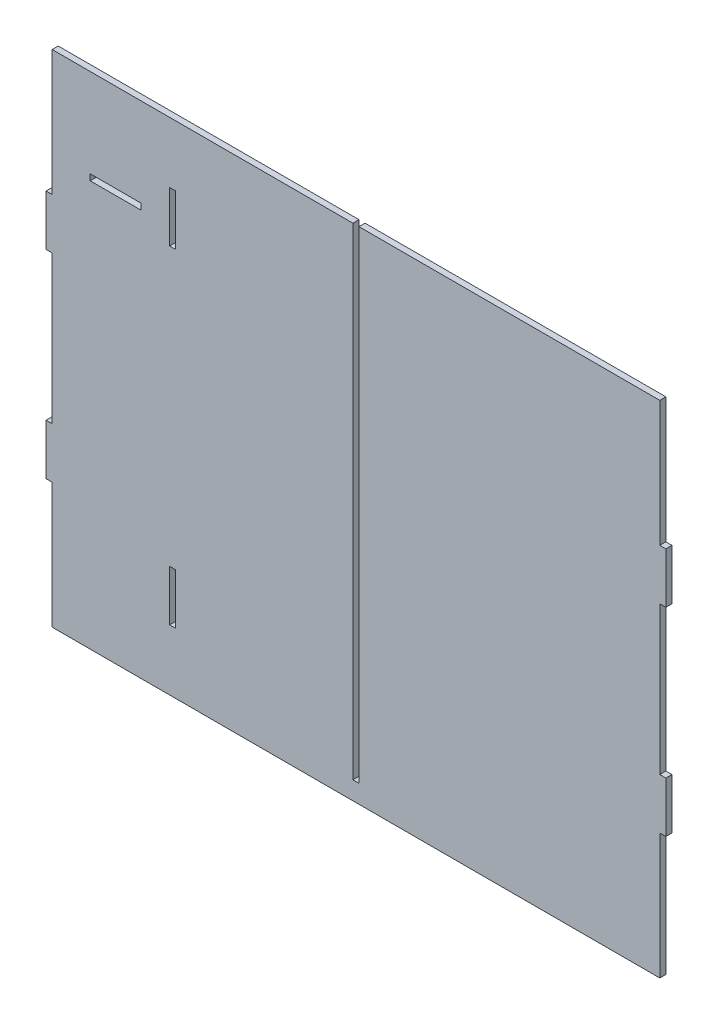
ISO-10303-21;
HEADER;
FILE_DESCRIPTION(('STEP AP214'),'2;1');
FILE_NAME('part.step','',(''),(''),'','','');
FILE_SCHEMA(('AUTOMOTIVE_DESIGN { 1 0 10303 214 1 1 1 1 }'));
ENDSEC;
DATA;
#1=APPLICATION_CONTEXT('core data for automotive mechanical design processes');
#2=APPLICATION_PROTOCOL_DEFINITION('international standard','automotive_design',2000,#1);
#3=PRODUCT_CONTEXT('',#1,'mechanical');
#4=PRODUCT('Part','Part','',(#3));
#5=PRODUCT_RELATED_PRODUCT_CATEGORY('part','',(#4));
#6=PRODUCT_DEFINITION_FORMATION('','',#4);
#7=PRODUCT_DEFINITION_CONTEXT('part definition',#1,'design');
#8=PRODUCT_DEFINITION('design','',#6,#7);
#9=PRODUCT_DEFINITION_SHAPE('','',#8);
#10=(LENGTH_UNIT() NAMED_UNIT(*) SI_UNIT(.MILLI.,.METRE.));
#11=(NAMED_UNIT(*) PLANE_ANGLE_UNIT() SI_UNIT($,.RADIAN.));
#12=(NAMED_UNIT(*) SI_UNIT($,.STERADIAN.) SOLID_ANGLE_UNIT());
#13=UNCERTAINTY_MEASURE_WITH_UNIT(LENGTH_MEASURE(1.E-05),#10,'distance_accuracy_value','');
#14=(GEOMETRIC_REPRESENTATION_CONTEXT(3) GLOBAL_UNCERTAINTY_ASSIGNED_CONTEXT((#13)) GLOBAL_UNIT_ASSIGNED_CONTEXT((#10,
#11,#12)) REPRESENTATION_CONTEXT('',''));
#15=CARTESIAN_POINT('',(0.,0.,0.));
#16=DIRECTION('',(0.,0.,1.));
#17=DIRECTION('',(1.,0.,0.));
#18=AXIS2_PLACEMENT_3D('',#15,#16,#17);
#19=CARTESIAN_POINT('',(0.,0.,6.));
#20=DIRECTION('',(0.,0.,-1.));
#21=DIRECTION('',(-1.,0.,0.));
#22=AXIS2_PLACEMENT_3D('',#19,#20,#21);
#23=PLANE('',#22);
#24=DIRECTION('',(0.,-1.,0.));
#25=VECTOR('',#24,1.);
#26=CARTESIAN_POINT('',(116.,-434.,6.));
#27=LINE('',#26,#25);
#28=CARTESIAN_POINT('',(116.,-384.,6.));
#29=VERTEX_POINT('',#28);
#30=CARTESIAN_POINT('',(116.,-434.,6.));
#31=VERTEX_POINT('',#30);
#32=EDGE_CURVE('E302',#29,#31,#27,.T.);
#33=ORIENTED_EDGE('',*,*,#32,.F.);
#34=DIRECTION('',(-1.,0.,0.));
#35=VECTOR('',#34,1.);
#36=CARTESIAN_POINT('',(116.,-384.,6.));
#37=LINE('',#36,#35);
#38=CARTESIAN_POINT('',(122.,-384.,6.));
#39=VERTEX_POINT('',#38);
#40=EDGE_CURVE('E310',#39,#29,#37,.T.);
#41=ORIENTED_EDGE('',*,*,#40,.F.);
#42=DIRECTION('',(0.,1.,0.));
#43=VECTOR('',#42,1.);
#44=CARTESIAN_POINT('',(122.,-434.,6.));
#45=LINE('',#44,#43);
#46=CARTESIAN_POINT('',(122.,-434.,6.));
#47=VERTEX_POINT('',#46);
#48=EDGE_CURVE('E307',#47,#39,#45,.T.);
#49=ORIENTED_EDGE('',*,*,#48,.F.);
#50=DIRECTION('',(1.,0.,0.));
#51=VECTOR('',#50,1.);
#52=CARTESIAN_POINT('',(116.,-434.,6.));
#53=LINE('',#52,#51);
#54=EDGE_CURVE('E304',#31,#47,#53,.T.);
#55=ORIENTED_EDGE('',*,*,#54,.F.);
#56=EDGE_LOOP('',(#33,#41,#49,#55));
#57=FACE_BOUND('',#56,.T.);
#58=DIRECTION('',(0.,-1.,0.));
#59=VECTOR('',#58,1.);
#60=CARTESIAN_POINT('',(0.,0.,6.));
#61=LINE('',#60,#59);
#62=CARTESIAN_POINT('',(0.,0.,6.));
#63=VERTEX_POINT('',#62);
#64=CARTESIAN_POINT('',(0.,-124.,6.));
#65=VERTEX_POINT('',#64);
#66=EDGE_CURVE('E364',#63,#65,#61,.T.);
#67=ORIENTED_EDGE('',*,*,#66,.T.);
#68=DIRECTION('',(-1.,0.,0.));
#69=VECTOR('',#68,1.);
#70=CARTESIAN_POINT('',(0.,-124.,6.));
#71=LINE('',#70,#69);
#72=CARTESIAN_POINT('',(-5.99999999999989,-124.,6.));
#73=VERTEX_POINT('',#72);
#74=EDGE_CURVE('E367',#65,#73,#71,.T.);
#75=ORIENTED_EDGE('',*,*,#74,.T.);
#76=DIRECTION('',(0.,-1.,0.));
#77=VECTOR('',#76,1.);
#78=CARTESIAN_POINT('',(-5.99999999999989,-124.,6.));
#79=LINE('',#78,#77);
#80=CARTESIAN_POINT('',(-5.99999999999989,-174.,6.));
#81=VERTEX_POINT('',#80);
#82=EDGE_CURVE('E370',#73,#81,#79,.T.);
#83=ORIENTED_EDGE('',*,*,#82,.T.);
#84=DIRECTION('',(1.,0.,0.));
#85=VECTOR('',#84,1.);
#86=CARTESIAN_POINT('',(0.,-174.,6.));
#87=LINE('',#86,#85);
#88=CARTESIAN_POINT('',(0.,-174.,6.));
#89=VERTEX_POINT('',#88);
#90=EDGE_CURVE('E372',#81,#89,#87,.T.);
#91=ORIENTED_EDGE('',*,*,#90,.T.);
#92=DIRECTION('',(0.,-1.,0.));
#93=VECTOR('',#92,1.);
#94=CARTESIAN_POINT('',(0.,-174.,6.));
#95=LINE('',#94,#93);
#96=CARTESIAN_POINT('',(0.,-320.,6.));
#97=VERTEX_POINT('',#96);
#98=EDGE_CURVE('E374',#89,#97,#95,.T.);
#99=ORIENTED_EDGE('',*,*,#98,.T.);
#100=DIRECTION('',(-1.,0.,0.));
#101=VECTOR('',#100,1.);
#102=CARTESIAN_POINT('',(0.,-320.,6.));
#103=LINE('',#102,#101);
#104=CARTESIAN_POINT('',(-5.99999999999988,-320.,6.));
#105=VERTEX_POINT('',#104);
#106=EDGE_CURVE('E376',#97,#105,#103,.T.);
#107=ORIENTED_EDGE('',*,*,#106,.T.);
#108=DIRECTION('',(0.,-1.,0.));
#109=VECTOR('',#108,1.);
#110=CARTESIAN_POINT('',(-5.99999999999986,-370.,6.));
#111=LINE('',#110,#109);
#112=CARTESIAN_POINT('',(-5.99999999999986,-370.,6.));
#113=VERTEX_POINT('',#112);
#114=EDGE_CURVE('E378',#105,#113,#111,.T.);
#115=ORIENTED_EDGE('',*,*,#114,.T.);
#116=DIRECTION('',(1.,0.,0.));
#117=VECTOR('',#116,1.);
#118=CARTESIAN_POINT('',(0.,-370.,6.));
#119=LINE('',#118,#117);
#120=CARTESIAN_POINT('',(0.,-370.,6.));
#121=VERTEX_POINT('',#120);
#122=EDGE_CURVE('E380',#113,#121,#119,.T.);
#123=ORIENTED_EDGE('',*,*,#122,.T.);
#124=DIRECTION('',(0.,-1.,0.));
#125=VECTOR('',#124,1.);
#126=CARTESIAN_POINT('',(0.,-370.,6.));
#127=LINE('',#126,#125);
#128=CARTESIAN_POINT('',(0.,-494.,6.));
#129=VERTEX_POINT('',#128);
#130=EDGE_CURVE('E382',#121,#129,#127,.T.);
#131=ORIENTED_EDGE('',*,*,#130,.T.);
#132=DIRECTION('',(1.,0.,0.));
#133=VECTOR('',#132,1.);
#134=CARTESIAN_POINT('',(0.,-494.,6.));
#135=LINE('',#134,#133);
#136=CARTESIAN_POINT('',(600.,-494.,6.));
#137=VERTEX_POINT('',#136);
#138=EDGE_CURVE('E384',#129,#137,#135,.T.);
#139=ORIENTED_EDGE('',*,*,#138,.T.);
#140=DIRECTION('',(0.,1.,0.));
#141=VECTOR('',#140,1.);
#142=CARTESIAN_POINT('',(600.,-370.,6.));
#143=LINE('',#142,#141);
#144=CARTESIAN_POINT('',(600.,-370.,6.));
#145=VERTEX_POINT('',#144);
#146=EDGE_CURVE('E386',#137,#145,#143,.T.);
#147=ORIENTED_EDGE('',*,*,#146,.T.);
#148=DIRECTION('',(1.,0.,0.));
#149=VECTOR('',#148,1.);
#150=CARTESIAN_POINT('',(600.,-370.,6.));
#151=LINE('',#150,#149);
#152=CARTESIAN_POINT('',(606.,-370.,6.));
#153=VERTEX_POINT('',#152);
#154=EDGE_CURVE('E388',#145,#153,#151,.T.);
#155=ORIENTED_EDGE('',*,*,#154,.T.);
#156=DIRECTION('',(0.,1.,0.));
#157=VECTOR('',#156,1.);
#158=CARTESIAN_POINT('',(606.,-370.,6.));
#159=LINE('',#158,#157);
#160=CARTESIAN_POINT('',(606.,-320.,6.));
#161=VERTEX_POINT('',#160);
#162=EDGE_CURVE('E390',#153,#161,#159,.T.);
#163=ORIENTED_EDGE('',*,*,#162,.T.);
#164=DIRECTION('',(-1.,0.,0.));
#165=VECTOR('',#164,1.);
#166=CARTESIAN_POINT('',(600.,-320.,6.));
#167=LINE('',#166,#165);
#168=CARTESIAN_POINT('',(600.,-320.,6.));
#169=VERTEX_POINT('',#168);
#170=EDGE_CURVE('E392',#161,#169,#167,.T.);
#171=ORIENTED_EDGE('',*,*,#170,.T.);
#172=DIRECTION('',(0.,1.,0.));
#173=VECTOR('',#172,1.);
#174=CARTESIAN_POINT('',(600.,-174.,6.));
#175=LINE('',#174,#173);
#176=CARTESIAN_POINT('',(600.,-174.,6.));
#177=VERTEX_POINT('',#176);
#178=EDGE_CURVE('E394',#169,#177,#175,.T.);
#179=ORIENTED_EDGE('',*,*,#178,.T.);
#180=DIRECTION('',(1.,0.,0.));
#181=VECTOR('',#180,1.);
#182=CARTESIAN_POINT('',(600.,-174.,6.));
#183=LINE('',#182,#181);
#184=CARTESIAN_POINT('',(606.,-174.,6.));
#185=VERTEX_POINT('',#184);
#186=EDGE_CURVE('E396',#177,#185,#183,.T.);
#187=ORIENTED_EDGE('',*,*,#186,.T.);
#188=DIRECTION('',(0.,1.,0.));
#189=VECTOR('',#188,1.);
#190=CARTESIAN_POINT('',(606.,-124.,6.));
#191=LINE('',#190,#189);
#192=CARTESIAN_POINT('',(606.,-124.,6.));
#193=VERTEX_POINT('',#192);
#194=EDGE_CURVE('E398',#185,#193,#191,.T.);
#195=ORIENTED_EDGE('',*,*,#194,.T.);
#196=DIRECTION('',(-1.,0.,0.));
#197=VECTOR('',#196,1.);
#198=CARTESIAN_POINT('',(600.,-124.,6.));
#199=LINE('',#198,#197);
#200=CARTESIAN_POINT('',(600.,-124.,6.));
#201=VERTEX_POINT('',#200);
#202=EDGE_CURVE('E400',#193,#201,#199,.T.);
#203=ORIENTED_EDGE('',*,*,#202,.T.);
#204=DIRECTION('',(0.,1.,0.));
#205=VECTOR('',#204,1.);
#206=CARTESIAN_POINT('',(600.,0.,6.));
#207=LINE('',#206,#205);
#208=CARTESIAN_POINT('',(600.,0.,6.));
#209=VERTEX_POINT('',#208);
#210=EDGE_CURVE('E402',#201,#209,#207,.T.);
#211=ORIENTED_EDGE('',*,*,#210,.T.);
#212=DIRECTION('',(-1.,0.,0.));
#213=VECTOR('',#212,1.);
#214=CARTESIAN_POINT('',(303.,0.,6.));
#215=LINE('',#214,#213);
#216=CARTESIAN_POINT('',(303.,0.,6.));
#217=VERTEX_POINT('',#216);
#218=EDGE_CURVE('E404',#209,#217,#215,.T.);
#219=ORIENTED_EDGE('',*,*,#218,.T.);
#220=DIRECTION('',(0.,-1.,0.));
#221=VECTOR('',#220,1.);
#222=CARTESIAN_POINT('',(303.,0.,6.));
#223=LINE('',#222,#221);
#224=CARTESIAN_POINT('',(303.,-476.,6.));
#225=VERTEX_POINT('',#224);
#226=EDGE_CURVE('E406',#217,#225,#223,.T.);
#227=ORIENTED_EDGE('',*,*,#226,.T.);
#228=DIRECTION('',(-1.,0.,0.));
#229=VECTOR('',#228,1.);
#230=CARTESIAN_POINT('',(297.,-476.,6.));
#231=LINE('',#230,#229);
#232=CARTESIAN_POINT('',(297.,-476.,6.));
#233=VERTEX_POINT('',#232);
#234=EDGE_CURVE('E408',#225,#233,#231,.T.);
#235=ORIENTED_EDGE('',*,*,#234,.T.);
#236=DIRECTION('',(0.,1.,0.));
#237=VECTOR('',#236,1.);
#238=CARTESIAN_POINT('',(297.,0.,6.));
#239=LINE('',#238,#237);
#240=CARTESIAN_POINT('',(297.,0.,6.));
#241=VERTEX_POINT('',#240);
#242=EDGE_CURVE('E410',#233,#241,#239,.T.);
#243=ORIENTED_EDGE('',*,*,#242,.T.);
#244=DIRECTION('',(-1.,0.,0.));
#245=VECTOR('',#244,1.);
#246=CARTESIAN_POINT('',(0.,0.,6.));
#247=LINE('',#246,#245);
#248=EDGE_CURVE('E412',#241,#63,#247,.T.);
#249=ORIENTED_EDGE('',*,*,#248,.T.);
#250=EDGE_LOOP('',(#67,#75,#83,#91,#99,#107,#115,#123,#131,#139,#147,#155,#163,#171,#179,#187,
#195,#203,#211,#219,#227,#235,#243,#249));
#251=FACE_BOUND('',#250,.T.);
#252=DIRECTION('',(0.,1.,0.));
#253=VECTOR('',#252,1.);
#254=CARTESIAN_POINT('',(122.,-60.,6.));
#255=LINE('',#254,#253);
#256=CARTESIAN_POINT('',(122.,-110.,6.));
#257=VERTEX_POINT('',#256);
#258=CARTESIAN_POINT('',(122.,-60.,6.));
#259=VERTEX_POINT('',#258);
#260=EDGE_CURVE('E333',#257,#259,#255,.T.);
#261=ORIENTED_EDGE('',*,*,#260,.F.);
#262=DIRECTION('',(1.,0.,0.));
#263=VECTOR('',#262,1.);
#264=CARTESIAN_POINT('',(116.,-110.,6.));
#265=LINE('',#264,#263);
#266=CARTESIAN_POINT('',(116.,-110.,6.));
#267=VERTEX_POINT('',#266);
#268=EDGE_CURVE('E341',#267,#257,#265,.T.);
#269=ORIENTED_EDGE('',*,*,#268,.F.);
#270=DIRECTION('',(0.,-1.,0.));
#271=VECTOR('',#270,1.);
#272=CARTESIAN_POINT('',(116.,-60.,6.));
#273=LINE('',#272,#271);
#274=CARTESIAN_POINT('',(116.,-60.,6.));
#275=VERTEX_POINT('',#274);
#276=EDGE_CURVE('E338',#275,#267,#273,.T.);
#277=ORIENTED_EDGE('',*,*,#276,.F.);
#278=DIRECTION('',(-1.,0.,0.));
#279=VECTOR('',#278,1.);
#280=CARTESIAN_POINT('',(116.,-60.,6.));
#281=LINE('',#280,#279);
#282=EDGE_CURVE('E335',#259,#275,#281,.T.);
#283=ORIENTED_EDGE('',*,*,#282,.F.);
#284=EDGE_LOOP('',(#261,#269,#277,#283));
#285=FACE_BOUND('',#284,.T.);
#286=DIRECTION('',(0.,1.,0.));
#287=VECTOR('',#286,1.);
#288=CARTESIAN_POINT('',(87.5,-87.5,6.));
#289=LINE('',#288,#287);
#290=CARTESIAN_POINT('',(87.5,-93.5,6.));
#291=VERTEX_POINT('',#290);
#292=CARTESIAN_POINT('',(87.5,-87.5,6.));
#293=VERTEX_POINT('',#292);
#294=EDGE_CURVE('E266',#291,#293,#289,.T.);
#295=ORIENTED_EDGE('',*,*,#294,.F.);
#296=DIRECTION('',(1.,0.,0.));
#297=VECTOR('',#296,1.);
#298=CARTESIAN_POINT('',(37.5,-93.5,6.));
#299=LINE('',#298,#297);
#300=CARTESIAN_POINT('',(37.5,-93.5,6.));
#301=VERTEX_POINT('',#300);
#302=EDGE_CURVE('E288',#301,#291,#299,.T.);
#303=ORIENTED_EDGE('',*,*,#302,.F.);
#304=DIRECTION('',(0.,-1.,0.));
#305=VECTOR('',#304,1.);
#306=CARTESIAN_POINT('',(37.5,-87.5,6.));
#307=LINE('',#306,#305);
#308=CARTESIAN_POINT('',(37.5,-87.5,6.));
#309=VERTEX_POINT('',#308);
#310=EDGE_CURVE('E286',#309,#301,#307,.T.);
#311=ORIENTED_EDGE('',*,*,#310,.F.);
#312=DIRECTION('',(-1.,0.,0.));
#313=VECTOR('',#312,1.);
#314=CARTESIAN_POINT('',(37.5,-87.5,6.));
#315=LINE('',#314,#313);
#316=EDGE_CURVE('E274',#293,#309,#315,.T.);
#317=ORIENTED_EDGE('',*,*,#316,.F.);
#318=EDGE_LOOP('',(#295,#303,#311,#317));
#319=FACE_BOUND('',#318,.T.);
#320=ADVANCED_FACE('F33',(#57,#251,#285,#319),#23,.F.);
#321=CARTESIAN_POINT('',(0.,0.,0.));
#322=DIRECTION('',(0.,0.,-1.));
#323=DIRECTION('',(-1.,0.,0.));
#324=AXIS2_PLACEMENT_3D('',#321,#322,#323);
#325=PLANE('',#324);
#326=DIRECTION('',(0.,-1.,0.));
#327=VECTOR('',#326,1.);
#328=CARTESIAN_POINT('',(0.,0.,0.));
#329=LINE('',#328,#327);
#330=CARTESIAN_POINT('',(0.,0.,0.));
#331=VERTEX_POINT('',#330);
#332=CARTESIAN_POINT('',(0.,-124.,0.));
#333=VERTEX_POINT('',#332);
#334=EDGE_CURVE('E363',#331,#333,#329,.T.);
#335=ORIENTED_EDGE('',*,*,#334,.F.);
#336=DIRECTION('',(-1.,0.,0.));
#337=VECTOR('',#336,1.);
#338=CARTESIAN_POINT('',(0.,0.,0.));
#339=LINE('',#338,#337);
#340=CARTESIAN_POINT('',(297.,0.,0.));
#341=VERTEX_POINT('',#340);
#342=EDGE_CURVE('E368',#341,#331,#339,.T.);
#343=ORIENTED_EDGE('',*,*,#342,.F.);
#344=DIRECTION('',(0.,1.,0.));
#345=VECTOR('',#344,1.);
#346=CARTESIAN_POINT('',(297.,0.,0.));
#347=LINE('',#346,#345);
#348=CARTESIAN_POINT('',(297.,-476.,0.));
#349=VERTEX_POINT('',#348);
#350=EDGE_CURVE('E459',#349,#341,#347,.T.);
#351=ORIENTED_EDGE('',*,*,#350,.F.);
#352=DIRECTION('',(-1.,0.,0.));
#353=VECTOR('',#352,1.);
#354=CARTESIAN_POINT('',(297.,-476.,0.));
#355=LINE('',#354,#353);
#356=CARTESIAN_POINT('',(303.,-476.,0.));
#357=VERTEX_POINT('',#356);
#358=EDGE_CURVE('E457',#357,#349,#355,.T.);
#359=ORIENTED_EDGE('',*,*,#358,.F.);
#360=DIRECTION('',(0.,-1.,0.));
#361=VECTOR('',#360,1.);
#362=CARTESIAN_POINT('',(303.,0.,0.));
#363=LINE('',#362,#361);
#364=CARTESIAN_POINT('',(303.,0.,0.));
#365=VERTEX_POINT('',#364);
#366=EDGE_CURVE('E455',#365,#357,#363,.T.);
#367=ORIENTED_EDGE('',*,*,#366,.F.);
#368=DIRECTION('',(-1.,0.,0.));
#369=VECTOR('',#368,1.);
#370=CARTESIAN_POINT('',(303.,0.,0.));
#371=LINE('',#370,#369);
#372=CARTESIAN_POINT('',(600.,0.,0.));
#373=VERTEX_POINT('',#372);
#374=EDGE_CURVE('E453',#373,#365,#371,.T.);
#375=ORIENTED_EDGE('',*,*,#374,.F.);
#376=DIRECTION('',(0.,1.,0.));
#377=VECTOR('',#376,1.);
#378=CARTESIAN_POINT('',(600.,0.,0.));
#379=LINE('',#378,#377);
#380=CARTESIAN_POINT('',(600.,-124.,0.));
#381=VERTEX_POINT('',#380);
#382=EDGE_CURVE('E451',#381,#373,#379,.T.);
#383=ORIENTED_EDGE('',*,*,#382,.F.);
#384=DIRECTION('',(-1.,0.,0.));
#385=VECTOR('',#384,1.);
#386=CARTESIAN_POINT('',(600.,-124.,0.));
#387=LINE('',#386,#385);
#388=CARTESIAN_POINT('',(606.,-124.,0.));
#389=VERTEX_POINT('',#388);
#390=EDGE_CURVE('E449',#389,#381,#387,.T.);
#391=ORIENTED_EDGE('',*,*,#390,.F.);
#392=DIRECTION('',(0.,1.,0.));
#393=VECTOR('',#392,1.);
#394=CARTESIAN_POINT('',(606.,-124.,0.));
#395=LINE('',#394,#393);
#396=CARTESIAN_POINT('',(606.,-174.,0.));
#397=VERTEX_POINT('',#396);
#398=EDGE_CURVE('E447',#397,#389,#395,.T.);
#399=ORIENTED_EDGE('',*,*,#398,.F.);
#400=DIRECTION('',(1.,0.,0.));
#401=VECTOR('',#400,1.);
#402=CARTESIAN_POINT('',(600.,-174.,0.));
#403=LINE('',#402,#401);
#404=CARTESIAN_POINT('',(600.,-174.,0.));
#405=VERTEX_POINT('',#404);
#406=EDGE_CURVE('E445',#405,#397,#403,.T.);
#407=ORIENTED_EDGE('',*,*,#406,.F.);
#408=DIRECTION('',(0.,1.,0.));
#409=VECTOR('',#408,1.);
#410=CARTESIAN_POINT('',(600.,-174.,0.));
#411=LINE('',#410,#409);
#412=CARTESIAN_POINT('',(600.,-320.,0.));
#413=VERTEX_POINT('',#412);
#414=EDGE_CURVE('E443',#413,#405,#411,.T.);
#415=ORIENTED_EDGE('',*,*,#414,.F.);
#416=DIRECTION('',(-1.,0.,0.));
#417=VECTOR('',#416,1.);
#418=CARTESIAN_POINT('',(600.,-320.,0.));
#419=LINE('',#418,#417);
#420=CARTESIAN_POINT('',(606.,-320.,0.));
#421=VERTEX_POINT('',#420);
#422=EDGE_CURVE('E441',#421,#413,#419,.T.);
#423=ORIENTED_EDGE('',*,*,#422,.F.);
#424=DIRECTION('',(0.,1.,0.));
#425=VECTOR('',#424,1.);
#426=CARTESIAN_POINT('',(606.,-370.,0.));
#427=LINE('',#426,#425);
#428=CARTESIAN_POINT('',(606.,-370.,0.));
#429=VERTEX_POINT('',#428);
#430=EDGE_CURVE('E439',#429,#421,#427,.T.);
#431=ORIENTED_EDGE('',*,*,#430,.F.);
#432=DIRECTION('',(1.,0.,0.));
#433=VECTOR('',#432,1.);
#434=CARTESIAN_POINT('',(600.,-370.,0.));
#435=LINE('',#434,#433);
#436=CARTESIAN_POINT('',(600.,-370.,0.));
#437=VERTEX_POINT('',#436);
#438=EDGE_CURVE('E437',#437,#429,#435,.T.);
#439=ORIENTED_EDGE('',*,*,#438,.F.);
#440=DIRECTION('',(0.,1.,0.));
#441=VECTOR('',#440,1.);
#442=CARTESIAN_POINT('',(600.,-370.,0.));
#443=LINE('',#442,#441);
#444=CARTESIAN_POINT('',(600.,-494.,0.));
#445=VERTEX_POINT('',#444);
#446=EDGE_CURVE('E435',#445,#437,#443,.T.);
#447=ORIENTED_EDGE('',*,*,#446,.F.);
#448=DIRECTION('',(1.,0.,0.));
#449=VECTOR('',#448,1.);
#450=CARTESIAN_POINT('',(0.,-494.,0.));
#451=LINE('',#450,#449);
#452=CARTESIAN_POINT('',(0.,-494.,0.));
#453=VERTEX_POINT('',#452);
#454=EDGE_CURVE('E433',#453,#445,#451,.T.);
#455=ORIENTED_EDGE('',*,*,#454,.F.);
#456=DIRECTION('',(0.,-1.,0.));
#457=VECTOR('',#456,1.);
#458=CARTESIAN_POINT('',(0.,-370.,0.));
#459=LINE('',#458,#457);
#460=CARTESIAN_POINT('',(0.,-370.,0.));
#461=VERTEX_POINT('',#460);
#462=EDGE_CURVE('E431',#461,#453,#459,.T.);
#463=ORIENTED_EDGE('',*,*,#462,.F.);
#464=DIRECTION('',(1.,0.,0.));
#465=VECTOR('',#464,1.);
#466=CARTESIAN_POINT('',(0.,-370.,0.));
#467=LINE('',#466,#465);
#468=CARTESIAN_POINT('',(-5.99999999999986,-370.,0.));
#469=VERTEX_POINT('',#468);
#470=EDGE_CURVE('E429',#469,#461,#467,.T.);
#471=ORIENTED_EDGE('',*,*,#470,.F.);
#472=DIRECTION('',(0.,-1.,0.));
#473=VECTOR('',#472,1.);
#474=CARTESIAN_POINT('',(-5.99999999999986,-370.,0.));
#475=LINE('',#474,#473);
#476=CARTESIAN_POINT('',(-5.99999999999988,-320.,0.));
#477=VERTEX_POINT('',#476);
#478=EDGE_CURVE('E427',#477,#469,#475,.T.);
#479=ORIENTED_EDGE('',*,*,#478,.F.);
#480=DIRECTION('',(-1.,0.,0.));
#481=VECTOR('',#480,1.);
#482=CARTESIAN_POINT('',(0.,-320.,0.));
#483=LINE('',#482,#481);
#484=CARTESIAN_POINT('',(0.,-320.,0.));
#485=VERTEX_POINT('',#484);
#486=EDGE_CURVE('E425',#485,#477,#483,.T.);
#487=ORIENTED_EDGE('',*,*,#486,.F.);
#488=DIRECTION('',(0.,-1.,0.));
#489=VECTOR('',#488,1.);
#490=CARTESIAN_POINT('',(0.,-174.,0.));
#491=LINE('',#490,#489);
#492=CARTESIAN_POINT('',(0.,-174.,0.));
#493=VERTEX_POINT('',#492);
#494=EDGE_CURVE('E423',#493,#485,#491,.T.);
#495=ORIENTED_EDGE('',*,*,#494,.F.);
#496=DIRECTION('',(1.,0.,0.));
#497=VECTOR('',#496,1.);
#498=CARTESIAN_POINT('',(0.,-174.,0.));
#499=LINE('',#498,#497);
#500=CARTESIAN_POINT('',(-5.99999999999989,-174.,0.));
#501=VERTEX_POINT('',#500);
#502=EDGE_CURVE('E421',#501,#493,#499,.T.);
#503=ORIENTED_EDGE('',*,*,#502,.F.);
#504=DIRECTION('',(0.,-1.,0.));
#505=VECTOR('',#504,1.);
#506=CARTESIAN_POINT('',(-5.99999999999989,-124.,0.));
#507=LINE('',#506,#505);
#508=CARTESIAN_POINT('',(-5.99999999999989,-124.,0.));
#509=VERTEX_POINT('',#508);
#510=EDGE_CURVE('E419',#509,#501,#507,.T.);
#511=ORIENTED_EDGE('',*,*,#510,.F.);
#512=DIRECTION('',(-1.,0.,0.));
#513=VECTOR('',#512,1.);
#514=CARTESIAN_POINT('',(0.,-124.,0.));
#515=LINE('',#514,#513);
#516=EDGE_CURVE('E417',#333,#509,#515,.T.);
#517=ORIENTED_EDGE('',*,*,#516,.F.);
#518=EDGE_LOOP('',(#335,#343,#351,#359,#367,#375,#383,#391,#399,#407,#415,#423,#431,#439,#447,
#455,#463,#471,#479,#487,#495,#503,#511,#517));
#519=FACE_BOUND('',#518,.T.);
#520=DIRECTION('',(1.,0.,0.));
#521=VECTOR('',#520,1.);
#522=CARTESIAN_POINT('',(116.,-110.,0.));
#523=LINE('',#522,#521);
#524=CARTESIAN_POINT('',(116.,-110.,0.));
#525=VERTEX_POINT('',#524);
#526=CARTESIAN_POINT('',(122.,-110.,0.));
#527=VERTEX_POINT('',#526);
#528=EDGE_CURVE('E336',#525,#527,#523,.T.);
#529=ORIENTED_EDGE('',*,*,#528,.T.);
#530=DIRECTION('',(0.,1.,0.));
#531=VECTOR('',#530,1.);
#532=CARTESIAN_POINT('',(122.,-60.,0.));
#533=LINE('',#532,#531);
#534=CARTESIAN_POINT('',(122.,-60.,0.));
#535=VERTEX_POINT('',#534);
#536=EDGE_CURVE('E332',#527,#535,#533,.T.);
#537=ORIENTED_EDGE('',*,*,#536,.T.);
#538=DIRECTION('',(-1.,0.,0.));
#539=VECTOR('',#538,1.);
#540=CARTESIAN_POINT('',(116.,-60.,0.));
#541=LINE('',#540,#539);
#542=CARTESIAN_POINT('',(116.,-60.,0.));
#543=VERTEX_POINT('',#542);
#544=EDGE_CURVE('E346',#535,#543,#541,.T.);
#545=ORIENTED_EDGE('',*,*,#544,.T.);
#546=DIRECTION('',(0.,-1.,0.));
#547=VECTOR('',#546,1.);
#548=CARTESIAN_POINT('',(116.,-60.,0.));
#549=LINE('',#548,#547);
#550=EDGE_CURVE('E349',#543,#525,#549,.T.);
#551=ORIENTED_EDGE('',*,*,#550,.T.);
#552=EDGE_LOOP('',(#529,#537,#545,#551));
#553=FACE_BOUND('',#552,.T.);
#554=DIRECTION('',(-1.,0.,0.));
#555=VECTOR('',#554,1.);
#556=CARTESIAN_POINT('',(116.,-384.,0.));
#557=LINE('',#556,#555);
#558=CARTESIAN_POINT('',(122.,-384.,0.));
#559=VERTEX_POINT('',#558);
#560=CARTESIAN_POINT('',(116.,-384.,0.));
#561=VERTEX_POINT('',#560);
#562=EDGE_CURVE('E305',#559,#561,#557,.T.);
#563=ORIENTED_EDGE('',*,*,#562,.T.);
#564=DIRECTION('',(0.,-1.,0.));
#565=VECTOR('',#564,1.);
#566=CARTESIAN_POINT('',(116.,-434.,0.));
#567=LINE('',#566,#565);
#568=CARTESIAN_POINT('',(116.,-434.,0.));
#569=VERTEX_POINT('',#568);
#570=EDGE_CURVE('E282',#561,#569,#567,.T.);
#571=ORIENTED_EDGE('',*,*,#570,.T.);
#572=DIRECTION('',(1.,0.,0.));
#573=VECTOR('',#572,1.);
#574=CARTESIAN_POINT('',(116.,-434.,0.));
#575=LINE('',#574,#573);
#576=CARTESIAN_POINT('',(122.,-434.,0.));
#577=VERTEX_POINT('',#576);
#578=EDGE_CURVE('E315',#569,#577,#575,.T.);
#579=ORIENTED_EDGE('',*,*,#578,.T.);
#580=DIRECTION('',(0.,1.,0.));
#581=VECTOR('',#580,1.);
#582=CARTESIAN_POINT('',(122.,-434.,0.));
#583=LINE('',#582,#581);
#584=EDGE_CURVE('E318',#577,#559,#583,.T.);
#585=ORIENTED_EDGE('',*,*,#584,.T.);
#586=EDGE_LOOP('',(#563,#571,#579,#585));
#587=FACE_BOUND('',#586,.T.);
#588=DIRECTION('',(1.,0.,0.));
#589=VECTOR('',#588,1.);
#590=CARTESIAN_POINT('',(37.5,-93.5,0.));
#591=LINE('',#590,#589);
#592=CARTESIAN_POINT('',(37.5,-93.5,0.));
#593=VERTEX_POINT('',#592);
#594=CARTESIAN_POINT('',(87.5,-93.5,0.));
#595=VERTEX_POINT('',#594);
#596=EDGE_CURVE('E275',#593,#595,#591,.T.);
#597=ORIENTED_EDGE('',*,*,#596,.T.);
#598=DIRECTION('',(0.,1.,0.));
#599=VECTOR('',#598,1.);
#600=CARTESIAN_POINT('',(87.5,-87.5,0.));
#601=LINE('',#600,#599);
#602=CARTESIAN_POINT('',(87.5,-87.5,0.));
#603=VERTEX_POINT('',#602);
#604=EDGE_CURVE('E56',#595,#603,#601,.T.);
#605=ORIENTED_EDGE('',*,*,#604,.T.);
#606=DIRECTION('',(-1.,0.,0.));
#607=VECTOR('',#606,1.);
#608=CARTESIAN_POINT('',(37.5,-87.5,0.));
#609=LINE('',#608,#607);
#610=CARTESIAN_POINT('',(37.5,-87.5,0.));
#611=VERTEX_POINT('',#610);
#612=EDGE_CURVE('E281',#603,#611,#609,.T.);
#613=ORIENTED_EDGE('',*,*,#612,.T.);
#614=DIRECTION('',(0.,-1.,0.));
#615=VECTOR('',#614,1.);
#616=CARTESIAN_POINT('',(37.5,-87.5,0.));
#617=LINE('',#616,#615);
#618=EDGE_CURVE('E294',#611,#593,#617,.T.);
#619=ORIENTED_EDGE('',*,*,#618,.T.);
#620=EDGE_LOOP('',(#597,#605,#613,#619));
#621=FACE_BOUND('',#620,.T.);
#622=ADVANCED_FACE('F537',(#519,#553,#587,#621),#325,.T.);
#623=CARTESIAN_POINT('',(0.,0.,6.));
#624=DIRECTION('',(1.,0.,0.));
#625=DIRECTION('',(0.,1.,0.));
#626=AXIS2_PLACEMENT_3D('',#623,#624,#625);
#627=PLANE('',#626);
#628=ORIENTED_EDGE('',*,*,#334,.T.);
#629=DIRECTION('',(0.,0.,-1.));
#630=VECTOR('',#629,1.);
#631=CARTESIAN_POINT('',(0.,-124.,6.));
#632=LINE('',#631,#630);
#633=EDGE_CURVE('E11',#65,#333,#632,.T.);
#634=ORIENTED_EDGE('',*,*,#633,.F.);
#635=ORIENTED_EDGE('',*,*,#66,.F.);
#636=DIRECTION('',(0.,0.,-1.));
#637=VECTOR('',#636,1.);
#638=CARTESIAN_POINT('',(0.,0.,6.));
#639=LINE('',#638,#637);
#640=EDGE_CURVE('E414',#63,#331,#639,.T.);
#641=ORIENTED_EDGE('',*,*,#640,.T.);
#642=EDGE_LOOP('',(#628,#634,#635,#641));
#643=FACE_BOUND('',#642,.T.);
#644=ADVANCED_FACE('F35',(#643),#627,.F.);
#645=CARTESIAN_POINT('',(0.,-124.,6.));
#646=DIRECTION('',(0.,-1.,0.));
#647=DIRECTION('',(0.,0.,-1.));
#648=AXIS2_PLACEMENT_3D('',#645,#646,#647);
#649=PLANE('',#648);
#650=ORIENTED_EDGE('',*,*,#516,.T.);
#651=DIRECTION('',(0.,0.,-1.));
#652=VECTOR('',#651,1.);
#653=CARTESIAN_POINT('',(-5.99999999999989,-124.,6.));
#654=LINE('',#653,#652);
#655=EDGE_CURVE('E41',#73,#509,#654,.T.);
#656=ORIENTED_EDGE('',*,*,#655,.F.);
#657=ORIENTED_EDGE('',*,*,#74,.F.);
#658=ORIENTED_EDGE('',*,*,#633,.T.);
#659=EDGE_LOOP('',(#650,#656,#657,#658));
#660=FACE_BOUND('',#659,.T.);
#661=ADVANCED_FACE('F555',(#660),#649,.F.);
#662=CARTESIAN_POINT('',(-5.99999999999989,-124.,6.));
#663=DIRECTION('',(1.,0.,0.));
#664=DIRECTION('',(0.,0.,-1.));
#665=AXIS2_PLACEMENT_3D('',#662,#663,#664);
#666=PLANE('',#665);
#667=ORIENTED_EDGE('',*,*,#510,.T.);
#668=DIRECTION('',(0.,0.,-1.));
#669=VECTOR('',#668,1.);
#670=CARTESIAN_POINT('',(-5.99999999999989,-174.,6.));
#671=LINE('',#670,#669);
#672=EDGE_CURVE('E524',#81,#501,#671,.T.);
#673=ORIENTED_EDGE('',*,*,#672,.F.);
#674=ORIENTED_EDGE('',*,*,#82,.F.);
#675=ORIENTED_EDGE('',*,*,#655,.T.);
#676=EDGE_LOOP('',(#667,#673,#674,#675));
#677=FACE_BOUND('',#676,.T.);
#678=ADVANCED_FACE('F531',(#677),#666,.F.);
#679=CARTESIAN_POINT('',(0.,-174.,6.));
#680=DIRECTION('',(0.,1.,0.));
#681=DIRECTION('',(0.,0.,1.));
#682=AXIS2_PLACEMENT_3D('',#679,#680,#681);
#683=PLANE('',#682);
#684=ORIENTED_EDGE('',*,*,#502,.T.);
#685=DIRECTION('',(0.,0.,-1.));
#686=VECTOR('',#685,1.);
#687=CARTESIAN_POINT('',(0.,-174.,6.));
#688=LINE('',#687,#686);
#689=EDGE_CURVE('E521',#89,#493,#688,.T.);
#690=ORIENTED_EDGE('',*,*,#689,.F.);
#691=ORIENTED_EDGE('',*,*,#90,.F.);
#692=ORIENTED_EDGE('',*,*,#672,.T.);
#693=EDGE_LOOP('',(#684,#690,#691,#692));
#694=FACE_BOUND('',#693,.T.);
#695=ADVANCED_FACE('F543',(#694),#683,.F.);
#696=CARTESIAN_POINT('',(0.,-174.,6.));
#697=DIRECTION('',(1.,0.,0.));
#698=DIRECTION('',(0.,1.,0.));
#699=AXIS2_PLACEMENT_3D('',#696,#697,#698);
#700=PLANE('',#699);
#701=ORIENTED_EDGE('',*,*,#494,.T.);
#702=DIRECTION('',(0.,0.,-1.));
#703=VECTOR('',#702,1.);
#704=CARTESIAN_POINT('',(0.,-320.,6.));
#705=LINE('',#704,#703);
#706=EDGE_CURVE('E518',#97,#485,#705,.T.);
#707=ORIENTED_EDGE('',*,*,#706,.F.);
#708=ORIENTED_EDGE('',*,*,#98,.F.);
#709=ORIENTED_EDGE('',*,*,#689,.T.);
#710=EDGE_LOOP('',(#701,#707,#708,#709));
#711=FACE_BOUND('',#710,.T.);
#712=ADVANCED_FACE('F547',(#711),#700,.F.);
#713=CARTESIAN_POINT('',(0.,-320.,6.));
#714=DIRECTION('',(0.,-1.,0.));
#715=DIRECTION('',(0.,0.,-1.));
#716=AXIS2_PLACEMENT_3D('',#713,#714,#715);
#717=PLANE('',#716);
#718=ORIENTED_EDGE('',*,*,#486,.T.);
#719=DIRECTION('',(0.,0.,-1.));
#720=VECTOR('',#719,1.);
#721=CARTESIAN_POINT('',(-5.99999999999988,-320.,6.));
#722=LINE('',#721,#720);
#723=EDGE_CURVE('E515',#105,#477,#722,.T.);
#724=ORIENTED_EDGE('',*,*,#723,.F.);
#725=ORIENTED_EDGE('',*,*,#106,.F.);
#726=ORIENTED_EDGE('',*,*,#706,.T.);
#727=EDGE_LOOP('',(#718,#724,#725,#726));
#728=FACE_BOUND('',#727,.T.);
#729=ADVANCED_FACE('F648',(#728),#717,.F.);
#730=CARTESIAN_POINT('',(-5.99999999999986,-370.,6.));
#731=DIRECTION('',(1.,0.,0.));
#732=DIRECTION('',(0.,1.,0.));
#733=AXIS2_PLACEMENT_3D('',#730,#731,#732);
#734=PLANE('',#733);
#735=ORIENTED_EDGE('',*,*,#478,.T.);
#736=DIRECTION('',(0.,0.,-1.));
#737=VECTOR('',#736,1.);
#738=CARTESIAN_POINT('',(-5.99999999999986,-370.,6.));
#739=LINE('',#738,#737);
#740=EDGE_CURVE('E512',#113,#469,#739,.T.);
#741=ORIENTED_EDGE('',*,*,#740,.F.);
#742=ORIENTED_EDGE('',*,*,#114,.F.);
#743=ORIENTED_EDGE('',*,*,#723,.T.);
#744=EDGE_LOOP('',(#735,#741,#742,#743));
#745=FACE_BOUND('',#744,.T.);
#746=ADVANCED_FACE('F646',(#745),#734,.F.);
#747=CARTESIAN_POINT('',(0.,-370.,6.));
#748=DIRECTION('',(0.,1.,0.));
#749=DIRECTION('',(0.,0.,1.));
#750=AXIS2_PLACEMENT_3D('',#747,#748,#749);
#751=PLANE('',#750);
#752=ORIENTED_EDGE('',*,*,#470,.T.);
#753=DIRECTION('',(0.,0.,-1.));
#754=VECTOR('',#753,1.);
#755=CARTESIAN_POINT('',(0.,-370.,6.));
#756=LINE('',#755,#754);
#757=EDGE_CURVE('E509',#121,#461,#756,.T.);
#758=ORIENTED_EDGE('',*,*,#757,.F.);
#759=ORIENTED_EDGE('',*,*,#122,.F.);
#760=ORIENTED_EDGE('',*,*,#740,.T.);
#761=EDGE_LOOP('',(#752,#758,#759,#760));
#762=FACE_BOUND('',#761,.T.);
#763=ADVANCED_FACE('F642',(#762),#751,.F.);
#764=CARTESIAN_POINT('',(0.,-370.,6.));
#765=DIRECTION('',(1.,0.,0.));
#766=DIRECTION('',(0.,1.,0.));
#767=AXIS2_PLACEMENT_3D('',#764,#765,#766);
#768=PLANE('',#767);
#769=ORIENTED_EDGE('',*,*,#462,.T.);
#770=DIRECTION('',(0.,0.,-1.));
#771=VECTOR('',#770,1.);
#772=CARTESIAN_POINT('',(0.,-494.,6.));
#773=LINE('',#772,#771);
#774=EDGE_CURVE('E506',#129,#453,#773,.T.);
#775=ORIENTED_EDGE('',*,*,#774,.F.);
#776=ORIENTED_EDGE('',*,*,#130,.F.);
#777=ORIENTED_EDGE('',*,*,#757,.T.);
#778=EDGE_LOOP('',(#769,#775,#776,#777));
#779=FACE_BOUND('',#778,.T.);
#780=ADVANCED_FACE('F637',(#779),#768,.F.);
#781=CARTESIAN_POINT('',(0.,-494.,6.));
#782=DIRECTION('',(0.,1.,0.));
#783=DIRECTION('',(0.,0.,1.));
#784=AXIS2_PLACEMENT_3D('',#781,#782,#783);
#785=PLANE('',#784);
#786=ORIENTED_EDGE('',*,*,#454,.T.);
#787=DIRECTION('',(0.,0.,-1.));
#788=VECTOR('',#787,1.);
#789=CARTESIAN_POINT('',(600.,-494.,6.));
#790=LINE('',#789,#788);
#791=EDGE_CURVE('E503',#137,#445,#790,.T.);
#792=ORIENTED_EDGE('',*,*,#791,.F.);
#793=ORIENTED_EDGE('',*,*,#138,.F.);
#794=ORIENTED_EDGE('',*,*,#774,.T.);
#795=EDGE_LOOP('',(#786,#792,#793,#794));
#796=FACE_BOUND('',#795,.T.);
#797=ADVANCED_FACE('F631',(#796),#785,.F.);
#798=CARTESIAN_POINT('',(600.,-370.,6.));
#799=DIRECTION('',(-1.,0.,0.));
#800=DIRECTION('',(0.,0.,1.));
#801=AXIS2_PLACEMENT_3D('',#798,#799,#800);
#802=PLANE('',#801);
#803=ORIENTED_EDGE('',*,*,#446,.T.);
#804=DIRECTION('',(0.,0.,-1.));
#805=VECTOR('',#804,1.);
#806=CARTESIAN_POINT('',(600.,-370.,6.));
#807=LINE('',#806,#805);
#808=EDGE_CURVE('E500',#145,#437,#807,.T.);
#809=ORIENTED_EDGE('',*,*,#808,.F.);
#810=ORIENTED_EDGE('',*,*,#146,.F.);
#811=ORIENTED_EDGE('',*,*,#791,.T.);
#812=EDGE_LOOP('',(#803,#809,#810,#811));
#813=FACE_BOUND('',#812,.T.);
#814=ADVANCED_FACE('F627',(#813),#802,.F.);
#815=CARTESIAN_POINT('',(600.,-370.,6.));
#816=DIRECTION('',(0.,1.,0.));
#817=DIRECTION('',(0.,0.,1.));
#818=AXIS2_PLACEMENT_3D('',#815,#816,#817);
#819=PLANE('',#818);
#820=ORIENTED_EDGE('',*,*,#438,.T.);
#821=DIRECTION('',(0.,0.,-1.));
#822=VECTOR('',#821,1.);
#823=CARTESIAN_POINT('',(606.,-370.,6.));
#824=LINE('',#823,#822);
#825=EDGE_CURVE('E497',#153,#429,#824,.T.);
#826=ORIENTED_EDGE('',*,*,#825,.F.);
#827=ORIENTED_EDGE('',*,*,#154,.F.);
#828=ORIENTED_EDGE('',*,*,#808,.T.);
#829=EDGE_LOOP('',(#820,#826,#827,#828));
#830=FACE_BOUND('',#829,.T.);
#831=ADVANCED_FACE('F622',(#830),#819,.F.);
#832=CARTESIAN_POINT('',(606.,-370.,6.));
#833=DIRECTION('',(-1.,0.,0.));
#834=DIRECTION('',(0.,-1.,0.));
#835=AXIS2_PLACEMENT_3D('',#832,#833,#834);
#836=PLANE('',#835);
#837=ORIENTED_EDGE('',*,*,#430,.T.);
#838=DIRECTION('',(0.,0.,-1.));
#839=VECTOR('',#838,1.);
#840=CARTESIAN_POINT('',(606.,-320.,6.));
#841=LINE('',#840,#839);
#842=EDGE_CURVE('E494',#161,#421,#841,.T.);
#843=ORIENTED_EDGE('',*,*,#842,.F.);
#844=ORIENTED_EDGE('',*,*,#162,.F.);
#845=ORIENTED_EDGE('',*,*,#825,.T.);
#846=EDGE_LOOP('',(#837,#843,#844,#845));
#847=FACE_BOUND('',#846,.T.);
#848=ADVANCED_FACE('F616',(#847),#836,.F.);
#849=CARTESIAN_POINT('',(600.,-320.,6.));
#850=DIRECTION('',(0.,-1.,0.));
#851=DIRECTION('',(0.,0.,-1.));
#852=AXIS2_PLACEMENT_3D('',#849,#850,#851);
#853=PLANE('',#852);
#854=ORIENTED_EDGE('',*,*,#422,.T.);
#855=DIRECTION('',(0.,0.,-1.));
#856=VECTOR('',#855,1.);
#857=CARTESIAN_POINT('',(600.,-320.,6.));
#858=LINE('',#857,#856);
#859=EDGE_CURVE('E491',#169,#413,#858,.T.);
#860=ORIENTED_EDGE('',*,*,#859,.F.);
#861=ORIENTED_EDGE('',*,*,#170,.F.);
#862=ORIENTED_EDGE('',*,*,#842,.T.);
#863=EDGE_LOOP('',(#854,#860,#861,#862));
#864=FACE_BOUND('',#863,.T.);
#865=ADVANCED_FACE('F612',(#864),#853,.F.);
#866=CARTESIAN_POINT('',(600.,-174.,6.));
#867=DIRECTION('',(-1.,0.,0.));
#868=DIRECTION('',(0.,0.,1.));
#869=AXIS2_PLACEMENT_3D('',#866,#867,#868);
#870=PLANE('',#869);
#871=ORIENTED_EDGE('',*,*,#414,.T.);
#872=DIRECTION('',(0.,0.,-1.));
#873=VECTOR('',#872,1.);
#874=CARTESIAN_POINT('',(600.,-174.,6.));
#875=LINE('',#874,#873);
#876=EDGE_CURVE('E488',#177,#405,#875,.T.);
#877=ORIENTED_EDGE('',*,*,#876,.F.);
#878=ORIENTED_EDGE('',*,*,#178,.F.);
#879=ORIENTED_EDGE('',*,*,#859,.T.);
#880=EDGE_LOOP('',(#871,#877,#878,#879));
#881=FACE_BOUND('',#880,.T.);
#882=ADVANCED_FACE('F607',(#881),#870,.F.);
#883=CARTESIAN_POINT('',(600.,-174.,6.));
#884=DIRECTION('',(0.,1.,0.));
#885=DIRECTION('',(0.,0.,1.));
#886=AXIS2_PLACEMENT_3D('',#883,#884,#885);
#887=PLANE('',#886);
#888=ORIENTED_EDGE('',*,*,#406,.T.);
#889=DIRECTION('',(0.,0.,-1.));
#890=VECTOR('',#889,1.);
#891=CARTESIAN_POINT('',(606.,-174.,6.));
#892=LINE('',#891,#890);
#893=EDGE_CURVE('E485',#185,#397,#892,.T.);
#894=ORIENTED_EDGE('',*,*,#893,.F.);
#895=ORIENTED_EDGE('',*,*,#186,.F.);
#896=ORIENTED_EDGE('',*,*,#876,.T.);
#897=EDGE_LOOP('',(#888,#894,#895,#896));
#898=FACE_BOUND('',#897,.T.);
#899=ADVANCED_FACE('F601',(#898),#887,.F.);
#900=CARTESIAN_POINT('',(606.,-124.,6.));
#901=DIRECTION('',(-1.,0.,0.));
#902=DIRECTION('',(0.,0.,1.));
#903=AXIS2_PLACEMENT_3D('',#900,#901,#902);
#904=PLANE('',#903);
#905=ORIENTED_EDGE('',*,*,#398,.T.);
#906=DIRECTION('',(0.,0.,-1.));
#907=VECTOR('',#906,1.);
#908=CARTESIAN_POINT('',(606.,-124.,6.));
#909=LINE('',#908,#907);
#910=EDGE_CURVE('E482',#193,#389,#909,.T.);
#911=ORIENTED_EDGE('',*,*,#910,.F.);
#912=ORIENTED_EDGE('',*,*,#194,.F.);
#913=ORIENTED_EDGE('',*,*,#893,.T.);
#914=EDGE_LOOP('',(#905,#911,#912,#913));
#915=FACE_BOUND('',#914,.T.);
#916=ADVANCED_FACE('F597',(#915),#904,.F.);
#917=CARTESIAN_POINT('',(600.,-124.,6.));
#918=DIRECTION('',(0.,-1.,0.));
#919=DIRECTION('',(0.,0.,-1.));
#920=AXIS2_PLACEMENT_3D('',#917,#918,#919);
#921=PLANE('',#920);
#922=ORIENTED_EDGE('',*,*,#390,.T.);
#923=DIRECTION('',(0.,0.,-1.));
#924=VECTOR('',#923,1.);
#925=CARTESIAN_POINT('',(600.,-124.,6.));
#926=LINE('',#925,#924);
#927=EDGE_CURVE('E479',#201,#381,#926,.T.);
#928=ORIENTED_EDGE('',*,*,#927,.F.);
#929=ORIENTED_EDGE('',*,*,#202,.F.);
#930=ORIENTED_EDGE('',*,*,#910,.T.);
#931=EDGE_LOOP('',(#922,#928,#929,#930));
#932=FACE_BOUND('',#931,.T.);
#933=ADVANCED_FACE('F592',(#932),#921,.F.);
#934=CARTESIAN_POINT('',(600.,0.,6.));
#935=DIRECTION('',(-1.,0.,0.));
#936=DIRECTION('',(0.,0.,1.));
#937=AXIS2_PLACEMENT_3D('',#934,#935,#936);
#938=PLANE('',#937);
#939=ORIENTED_EDGE('',*,*,#382,.T.);
#940=DIRECTION('',(0.,0.,-1.));
#941=VECTOR('',#940,1.);
#942=CARTESIAN_POINT('',(600.,0.,6.));
#943=LINE('',#942,#941);
#944=EDGE_CURVE('E476',#209,#373,#943,.T.);
#945=ORIENTED_EDGE('',*,*,#944,.F.);
#946=ORIENTED_EDGE('',*,*,#210,.F.);
#947=ORIENTED_EDGE('',*,*,#927,.T.);
#948=EDGE_LOOP('',(#939,#945,#946,#947));
#949=FACE_BOUND('',#948,.T.);
#950=ADVANCED_FACE('F586',(#949),#938,.F.);
#951=CARTESIAN_POINT('',(303.,0.,6.));
#952=DIRECTION('',(0.,-1.,0.));
#953=DIRECTION('',(0.,0.,-1.));
#954=AXIS2_PLACEMENT_3D('',#951,#952,#953);
#955=PLANE('',#954);
#956=ORIENTED_EDGE('',*,*,#374,.T.);
#957=DIRECTION('',(0.,0.,-1.));
#958=VECTOR('',#957,1.);
#959=CARTESIAN_POINT('',(303.,0.,6.));
#960=LINE('',#959,#958);
#961=EDGE_CURVE('E473',#217,#365,#960,.T.);
#962=ORIENTED_EDGE('',*,*,#961,.F.);
#963=ORIENTED_EDGE('',*,*,#218,.F.);
#964=ORIENTED_EDGE('',*,*,#944,.T.);
#965=EDGE_LOOP('',(#956,#962,#963,#964));
#966=FACE_BOUND('',#965,.T.);
#967=ADVANCED_FACE('F582',(#966),#955,.F.);
#968=CARTESIAN_POINT('',(303.,0.,6.));
#969=DIRECTION('',(1.,0.,0.));
#970=DIRECTION('',(0.,1.,0.));
#971=AXIS2_PLACEMENT_3D('',#968,#969,#970);
#972=PLANE('',#971);
#973=ORIENTED_EDGE('',*,*,#366,.T.);
#974=DIRECTION('',(0.,0.,-1.));
#975=VECTOR('',#974,1.);
#976=CARTESIAN_POINT('',(303.,-476.,6.));
#977=LINE('',#976,#975);
#978=EDGE_CURVE('E470',#225,#357,#977,.T.);
#979=ORIENTED_EDGE('',*,*,#978,.F.);
#980=ORIENTED_EDGE('',*,*,#226,.F.);
#981=ORIENTED_EDGE('',*,*,#961,.T.);
#982=EDGE_LOOP('',(#973,#979,#980,#981));
#983=FACE_BOUND('',#982,.T.);
#984=ADVANCED_FACE('F577',(#983),#972,.F.);
#985=CARTESIAN_POINT('',(297.,-476.,6.));
#986=DIRECTION('',(0.,-1.,0.));
#987=DIRECTION('',(0.,0.,-1.));
#988=AXIS2_PLACEMENT_3D('',#985,#986,#987);
#989=PLANE('',#988);
#990=ORIENTED_EDGE('',*,*,#358,.T.);
#991=DIRECTION('',(0.,0.,-1.));
#992=VECTOR('',#991,1.);
#993=CARTESIAN_POINT('',(297.,-476.,6.));
#994=LINE('',#993,#992);
#995=EDGE_CURVE('E467',#233,#349,#994,.T.);
#996=ORIENTED_EDGE('',*,*,#995,.F.);
#997=ORIENTED_EDGE('',*,*,#234,.F.);
#998=ORIENTED_EDGE('',*,*,#978,.T.);
#999=EDGE_LOOP('',(#990,#996,#997,#998));
#1000=FACE_BOUND('',#999,.T.);
#1001=ADVANCED_FACE('F571',(#1000),#989,.F.);
#1002=CARTESIAN_POINT('',(297.,0.,6.));
#1003=DIRECTION('',(-1.,0.,0.));
#1004=DIRECTION('',(0.,-1.,0.));
#1005=AXIS2_PLACEMENT_3D('',#1002,#1003,#1004);
#1006=PLANE('',#1005);
#1007=ORIENTED_EDGE('',*,*,#350,.T.);
#1008=DIRECTION('',(0.,0.,-1.));
#1009=VECTOR('',#1008,1.);
#1010=CARTESIAN_POINT('',(297.,0.,6.));
#1011=LINE('',#1010,#1009);
#1012=EDGE_CURVE('E464',#241,#341,#1011,.T.);
#1013=ORIENTED_EDGE('',*,*,#1012,.F.);
#1014=ORIENTED_EDGE('',*,*,#242,.F.);
#1015=ORIENTED_EDGE('',*,*,#995,.T.);
#1016=EDGE_LOOP('',(#1007,#1013,#1014,#1015));
#1017=FACE_BOUND('',#1016,.T.);
#1018=ADVANCED_FACE('F567',(#1017),#1006,.F.);
#1019=CARTESIAN_POINT('',(0.,0.,6.));
#1020=DIRECTION('',(0.,-1.,0.));
#1021=DIRECTION('',(0.,0.,-1.));
#1022=AXIS2_PLACEMENT_3D('',#1019,#1020,#1021);
#1023=PLANE('',#1022);
#1024=ORIENTED_EDGE('',*,*,#342,.T.);
#1025=ORIENTED_EDGE('',*,*,#640,.F.);
#1026=ORIENTED_EDGE('',*,*,#248,.F.);
#1027=ORIENTED_EDGE('',*,*,#1012,.T.);
#1028=EDGE_LOOP('',(#1024,#1025,#1026,#1027));
#1029=FACE_BOUND('',#1028,.T.);
#1030=ADVANCED_FACE('F562',(#1029),#1023,.F.);
#1031=CARTESIAN_POINT('',(122.,-60.,6.));
#1032=DIRECTION('',(-1.,0.,0.));
#1033=DIRECTION('',(0.,0.,1.));
#1034=AXIS2_PLACEMENT_3D('',#1031,#1032,#1033);
#1035=PLANE('',#1034);
#1036=ORIENTED_EDGE('',*,*,#536,.F.);
#1037=DIRECTION('',(0.,0.,-1.));
#1038=VECTOR('',#1037,1.);
#1039=CARTESIAN_POINT('',(122.,-110.,6.));
#1040=LINE('',#1039,#1038);
#1041=EDGE_CURVE('E343',#257,#527,#1040,.T.);
#1042=ORIENTED_EDGE('',*,*,#1041,.F.);
#1043=ORIENTED_EDGE('',*,*,#260,.T.);
#1044=DIRECTION('',(0.,0.,-1.));
#1045=VECTOR('',#1044,1.);
#1046=CARTESIAN_POINT('',(122.,-60.,6.));
#1047=LINE('',#1046,#1045);
#1048=EDGE_CURVE('E360',#259,#535,#1047,.T.);
#1049=ORIENTED_EDGE('',*,*,#1048,.T.);
#1050=EDGE_LOOP('',(#1036,#1042,#1043,#1049));
#1051=FACE_BOUND('',#1050,.T.);
#1052=ADVANCED_FACE('F666',(#1051),#1035,.T.);
#1053=CARTESIAN_POINT('',(116.,-60.,6.));
#1054=DIRECTION('',(0.,-1.,0.));
#1055=DIRECTION('',(0.,0.,-1.));
#1056=AXIS2_PLACEMENT_3D('',#1053,#1054,#1055);
#1057=PLANE('',#1056);
#1058=ORIENTED_EDGE('',*,*,#544,.F.);
#1059=ORIENTED_EDGE('',*,*,#1048,.F.);
#1060=ORIENTED_EDGE('',*,*,#282,.T.);
#1061=DIRECTION('',(0.,0.,-1.));
#1062=VECTOR('',#1061,1.);
#1063=CARTESIAN_POINT('',(116.,-60.,6.));
#1064=LINE('',#1063,#1062);
#1065=EDGE_CURVE('E358',#275,#543,#1064,.T.);
#1066=ORIENTED_EDGE('',*,*,#1065,.T.);
#1067=EDGE_LOOP('',(#1058,#1059,#1060,#1066));
#1068=FACE_BOUND('',#1067,.T.);
#1069=ADVANCED_FACE('F776',(#1068),#1057,.T.);
#1070=CARTESIAN_POINT('',(116.,-60.,6.));
#1071=DIRECTION('',(1.,0.,0.));
#1072=DIRECTION('',(0.,1.,0.));
#1073=AXIS2_PLACEMENT_3D('',#1070,#1071,#1072);
#1074=PLANE('',#1073);
#1075=ORIENTED_EDGE('',*,*,#550,.F.);
#1076=ORIENTED_EDGE('',*,*,#1065,.F.);
#1077=ORIENTED_EDGE('',*,*,#276,.T.);
#1078=DIRECTION('',(0.,0.,-1.));
#1079=VECTOR('',#1078,1.);
#1080=CARTESIAN_POINT('',(116.,-110.,6.));
#1081=LINE('',#1080,#1079);
#1082=EDGE_CURVE('E356',#267,#525,#1081,.T.);
#1083=ORIENTED_EDGE('',*,*,#1082,.T.);
#1084=EDGE_LOOP('',(#1075,#1076,#1077,#1083));
#1085=FACE_BOUND('',#1084,.T.);
#1086=ADVANCED_FACE('F783',(#1085),#1074,.T.);
#1087=CARTESIAN_POINT('',(116.,-110.,6.));
#1088=DIRECTION('',(0.,1.,0.));
#1089=DIRECTION('',(0.,0.,1.));
#1090=AXIS2_PLACEMENT_3D('',#1087,#1088,#1089);
#1091=PLANE('',#1090);
#1092=ORIENTED_EDGE('',*,*,#528,.F.);
#1093=ORIENTED_EDGE('',*,*,#1082,.F.);
#1094=ORIENTED_EDGE('',*,*,#268,.T.);
#1095=ORIENTED_EDGE('',*,*,#1041,.T.);
#1096=EDGE_LOOP('',(#1092,#1093,#1094,#1095));
#1097=FACE_BOUND('',#1096,.T.);
#1098=ADVANCED_FACE('F790',(#1097),#1091,.T.);
#1099=CARTESIAN_POINT('',(116.,-434.,6.));
#1100=DIRECTION('',(1.,0.,0.));
#1101=DIRECTION('',(0.,0.,-1.));
#1102=AXIS2_PLACEMENT_3D('',#1099,#1100,#1101);
#1103=PLANE('',#1102);
#1104=ORIENTED_EDGE('',*,*,#570,.F.);
#1105=DIRECTION('',(0.,0.,-1.));
#1106=VECTOR('',#1105,1.);
#1107=CARTESIAN_POINT('',(116.,-384.,6.));
#1108=LINE('',#1107,#1106);
#1109=EDGE_CURVE('E312',#29,#561,#1108,.T.);
#1110=ORIENTED_EDGE('',*,*,#1109,.F.);
#1111=ORIENTED_EDGE('',*,*,#32,.T.);
#1112=DIRECTION('',(0.,0.,-1.));
#1113=VECTOR('',#1112,1.);
#1114=CARTESIAN_POINT('',(116.,-434.,6.));
#1115=LINE('',#1114,#1113);
#1116=EDGE_CURVE('E329',#31,#569,#1115,.T.);
#1117=ORIENTED_EDGE('',*,*,#1116,.T.);
#1118=EDGE_LOOP('',(#1104,#1110,#1111,#1117));
#1119=FACE_BOUND('',#1118,.T.);
#1120=ADVANCED_FACE('F798',(#1119),#1103,.T.);
#1121=CARTESIAN_POINT('',(116.,-434.,6.));
#1122=DIRECTION('',(0.,1.,0.));
#1123=DIRECTION('',(0.,0.,1.));
#1124=AXIS2_PLACEMENT_3D('',#1121,#1122,#1123);
#1125=PLANE('',#1124);
#1126=ORIENTED_EDGE('',*,*,#578,.F.);
#1127=ORIENTED_EDGE('',*,*,#1116,.F.);
#1128=ORIENTED_EDGE('',*,*,#54,.T.);
#1129=DIRECTION('',(0.,0.,-1.));
#1130=VECTOR('',#1129,1.);
#1131=CARTESIAN_POINT('',(122.,-434.,6.));
#1132=LINE('',#1131,#1130);
#1133=EDGE_CURVE('E327',#47,#577,#1132,.T.);
#1134=ORIENTED_EDGE('',*,*,#1133,.T.);
#1135=EDGE_LOOP('',(#1126,#1127,#1128,#1134));
#1136=FACE_BOUND('',#1135,.T.);
#1137=ADVANCED_FACE('F806',(#1136),#1125,.T.);
#1138=CARTESIAN_POINT('',(122.,-434.,6.));
#1139=DIRECTION('',(-1.,0.,0.));
#1140=DIRECTION('',(0.,-1.,0.));
#1141=AXIS2_PLACEMENT_3D('',#1138,#1139,#1140);
#1142=PLANE('',#1141);
#1143=ORIENTED_EDGE('',*,*,#584,.F.);
#1144=ORIENTED_EDGE('',*,*,#1133,.F.);
#1145=ORIENTED_EDGE('',*,*,#48,.T.);
#1146=DIRECTION('',(0.,0.,-1.));
#1147=VECTOR('',#1146,1.);
#1148=CARTESIAN_POINT('',(122.,-384.,6.));
#1149=LINE('',#1148,#1147);
#1150=EDGE_CURVE('E325',#39,#559,#1149,.T.);
#1151=ORIENTED_EDGE('',*,*,#1150,.T.);
#1152=EDGE_LOOP('',(#1143,#1144,#1145,#1151));
#1153=FACE_BOUND('',#1152,.T.);
#1154=ADVANCED_FACE('F814',(#1153),#1142,.T.);
#1155=CARTESIAN_POINT('',(116.,-384.,6.));
#1156=DIRECTION('',(0.,-1.,0.));
#1157=DIRECTION('',(0.,0.,-1.));
#1158=AXIS2_PLACEMENT_3D('',#1155,#1156,#1157);
#1159=PLANE('',#1158);
#1160=ORIENTED_EDGE('',*,*,#562,.F.);
#1161=ORIENTED_EDGE('',*,*,#1150,.F.);
#1162=ORIENTED_EDGE('',*,*,#40,.T.);
#1163=ORIENTED_EDGE('',*,*,#1109,.T.);
#1164=EDGE_LOOP('',(#1160,#1161,#1162,#1163));
#1165=FACE_BOUND('',#1164,.T.);
#1166=ADVANCED_FACE('F822',(#1165),#1159,.T.);
#1167=CARTESIAN_POINT('',(87.5,-87.5,6.));
#1168=DIRECTION('',(-1.,0.,0.));
#1169=DIRECTION('',(0.,-1.,0.));
#1170=AXIS2_PLACEMENT_3D('',#1167,#1168,#1169);
#1171=PLANE('',#1170);
#1172=ORIENTED_EDGE('',*,*,#604,.F.);
#1173=DIRECTION('',(0.,0.,-1.));
#1174=VECTOR('',#1173,1.);
#1175=CARTESIAN_POINT('',(87.5,-93.5,6.));
#1176=LINE('',#1175,#1174);
#1177=EDGE_CURVE('E270',#291,#595,#1176,.T.);
#1178=ORIENTED_EDGE('',*,*,#1177,.F.);
#1179=ORIENTED_EDGE('',*,*,#294,.T.);
#1180=DIRECTION('',(0.,0.,-1.));
#1181=VECTOR('',#1180,1.);
#1182=CARTESIAN_POINT('',(87.5,-87.5,6.));
#1183=LINE('',#1182,#1181);
#1184=EDGE_CURVE('E269',#293,#603,#1183,.T.);
#1185=ORIENTED_EDGE('',*,*,#1184,.T.);
#1186=EDGE_LOOP('',(#1172,#1178,#1179,#1185));
#1187=FACE_BOUND('',#1186,.T.);
#1188=ADVANCED_FACE('F268',(#1187),#1171,.T.);
#1189=CARTESIAN_POINT('',(37.5,-87.5,6.));
#1190=DIRECTION('',(0.,-1.,0.));
#1191=DIRECTION('',(0.,0.,-1.));
#1192=AXIS2_PLACEMENT_3D('',#1189,#1190,#1191);
#1193=PLANE('',#1192);
#1194=ORIENTED_EDGE('',*,*,#612,.F.);
#1195=ORIENTED_EDGE('',*,*,#1184,.F.);
#1196=ORIENTED_EDGE('',*,*,#316,.T.);
#1197=DIRECTION('',(0.,0.,-1.));
#1198=VECTOR('',#1197,1.);
#1199=CARTESIAN_POINT('',(37.5,-87.5,6.));
#1200=LINE('',#1199,#1198);
#1201=EDGE_CURVE('E283',#309,#611,#1200,.T.);
#1202=ORIENTED_EDGE('',*,*,#1201,.T.);
#1203=EDGE_LOOP('',(#1194,#1195,#1196,#1202));
#1204=FACE_BOUND('',#1203,.T.);
#1205=ADVANCED_FACE('F278',(#1204),#1193,.T.);
#1206=CARTESIAN_POINT('',(37.5,-87.5,6.));
#1207=DIRECTION('',(1.,0.,0.));
#1208=DIRECTION('',(0.,1.,0.));
#1209=AXIS2_PLACEMENT_3D('',#1206,#1207,#1208);
#1210=PLANE('',#1209);
#1211=ORIENTED_EDGE('',*,*,#618,.F.);
#1212=ORIENTED_EDGE('',*,*,#1201,.F.);
#1213=ORIENTED_EDGE('',*,*,#310,.T.);
#1214=DIRECTION('',(0.,0.,-1.));
#1215=VECTOR('',#1214,1.);
#1216=CARTESIAN_POINT('',(37.5,-93.5,6.));
#1217=LINE('',#1216,#1215);
#1218=EDGE_CURVE('E48',#301,#593,#1217,.T.);
#1219=ORIENTED_EDGE('',*,*,#1218,.T.);
#1220=EDGE_LOOP('',(#1211,#1212,#1213,#1219));
#1221=FACE_BOUND('',#1220,.T.);
#1222=ADVANCED_FACE('F843',(#1221),#1210,.T.);
#1223=CARTESIAN_POINT('',(37.5,-93.5,6.));
#1224=DIRECTION('',(0.,1.,0.));
#1225=DIRECTION('',(0.,0.,1.));
#1226=AXIS2_PLACEMENT_3D('',#1223,#1224,#1225);
#1227=PLANE('',#1226);
#1228=ORIENTED_EDGE('',*,*,#596,.F.);
#1229=ORIENTED_EDGE('',*,*,#1218,.F.);
#1230=ORIENTED_EDGE('',*,*,#302,.T.);
#1231=ORIENTED_EDGE('',*,*,#1177,.T.);
#1232=EDGE_LOOP('',(#1228,#1229,#1230,#1231));
#1233=FACE_BOUND('',#1232,.T.);
#1234=ADVANCED_FACE('F850',(#1233),#1227,.T.);
#1235=CLOSED_SHELL('',(#320,#622,#644,#661,#678,#695,#712,#729,#746,#763,#780,#797,#814,#831,
#848,#865,#882,#899,#916,#933,#950,#967,#984,#1001,#1018,#1030,#1052,#1069,#1086,#1098,#1120,
#1137,#1154,#1166,#1188,#1205,#1222,#1234));
#1236=MANIFOLD_SOLID_BREP('B2',#1235);
#1237=ADVANCED_BREP_SHAPE_REPRESENTATION('',(#18,#1236),#14);
#1238=SHAPE_DEFINITION_REPRESENTATION(#9,#1237);
ENDSEC;
END-ISO-10303-21;
